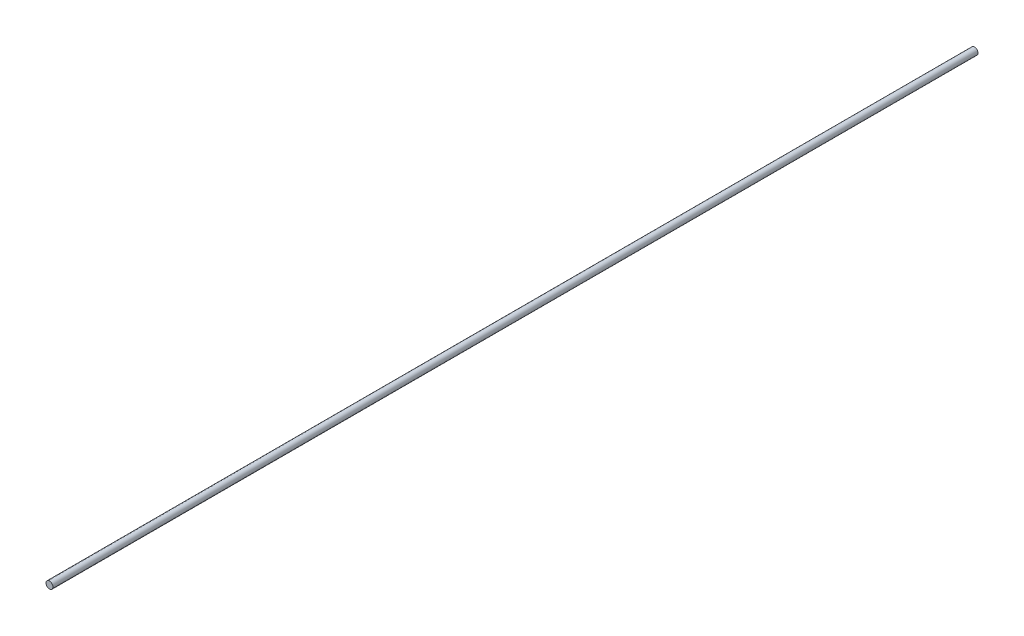
ISO-10303-21;
HEADER;
FILE_DESCRIPTION(('STEP AP214'),'2;1');
FILE_NAME('part.step','',(''),(''),'','','');
FILE_SCHEMA(('AUTOMOTIVE_DESIGN { 1 0 10303 214 1 1 1 1 }'));
ENDSEC;
DATA;
#1=APPLICATION_CONTEXT('core data for automotive mechanical design processes');
#2=APPLICATION_PROTOCOL_DEFINITION('international standard','automotive_design',2000,#1);
#3=PRODUCT_CONTEXT('',#1,'mechanical');
#4=PRODUCT('Part','Part','',(#3));
#5=PRODUCT_RELATED_PRODUCT_CATEGORY('part','',(#4));
#6=PRODUCT_DEFINITION_FORMATION('','',#4);
#7=PRODUCT_DEFINITION_CONTEXT('part definition',#1,'design');
#8=PRODUCT_DEFINITION('design','',#6,#7);
#9=PRODUCT_DEFINITION_SHAPE('','',#8);
#10=(LENGTH_UNIT() NAMED_UNIT(*) SI_UNIT(.MILLI.,.METRE.));
#11=(NAMED_UNIT(*) PLANE_ANGLE_UNIT() SI_UNIT($,.RADIAN.));
#12=(NAMED_UNIT(*) SI_UNIT($,.STERADIAN.) SOLID_ANGLE_UNIT());
#13=UNCERTAINTY_MEASURE_WITH_UNIT(LENGTH_MEASURE(1.E-05),#10,'distance_accuracy_value','');
#14=(GEOMETRIC_REPRESENTATION_CONTEXT(3) GLOBAL_UNCERTAINTY_ASSIGNED_CONTEXT((#13)) GLOBAL_UNIT_ASSIGNED_CONTEXT((#10,
#11,#12)) REPRESENTATION_CONTEXT('',''));
#15=CARTESIAN_POINT('',(0.,0.,0.));
#16=DIRECTION('',(0.,0.,1.));
#17=DIRECTION('',(1.,0.,0.));
#18=AXIS2_PLACEMENT_3D('',#15,#16,#17);
#19=CARTESIAN_POINT('',(0.,0.,400.));
#20=DIRECTION('',(0.,0.,-1.));
#21=DIRECTION('',(-1.,0.,0.));
#22=AXIS2_PLACEMENT_3D('',#19,#20,#21);
#23=CYLINDRICAL_SURFACE('',#22,1.5);
#24=CARTESIAN_POINT('',(0.,0.,400.));
#25=DIRECTION('',(0.,0.,1.));
#26=DIRECTION('',(1.,0.,0.));
#27=AXIS2_PLACEMENT_3D('',#24,#25,#26);
#28=CIRCLE('',#27,1.5);
#29=CARTESIAN_POINT('',(1.5,0.,400.));
#30=VERTEX_POINT('',#29);
#31=EDGE_CURVE('E10',#30,#30,#28,.T.);
#32=ORIENTED_EDGE('',*,*,#31,.F.);
#33=EDGE_LOOP('',(#32));
#34=FACE_BOUND('',#33,.T.);
#35=CARTESIAN_POINT('',(0.,0.,0.));
#36=DIRECTION('',(0.,0.,1.));
#37=DIRECTION('',(1.,0.,0.));
#38=AXIS2_PLACEMENT_3D('',#35,#36,#37);
#39=CIRCLE('',#38,1.5);
#40=CARTESIAN_POINT('',(1.5,0.,0.));
#41=VERTEX_POINT('',#40);
#42=EDGE_CURVE('E40',#41,#41,#39,.T.);
#43=ORIENTED_EDGE('',*,*,#42,.T.);
#44=EDGE_LOOP('',(#43));
#45=FACE_BOUND('',#44,.T.);
#46=ADVANCED_FACE('F37',(#34,#45),#23,.T.);
#47=CARTESIAN_POINT('',(0.,0.,400.));
#48=DIRECTION('',(0.,0.,1.));
#49=DIRECTION('',(1.,0.,0.));
#50=AXIS2_PLACEMENT_3D('',#47,#48,#49);
#51=PLANE('',#50);
#52=ORIENTED_EDGE('',*,*,#31,.T.);
#53=EDGE_LOOP('',(#52));
#54=FACE_BOUND('',#53,.T.);
#55=ADVANCED_FACE('F52',(#54),#51,.T.);
#56=CARTESIAN_POINT('',(0.,0.,0.));
#57=DIRECTION('',(0.,0.,1.));
#58=DIRECTION('',(1.,0.,0.));
#59=AXIS2_PLACEMENT_3D('',#56,#57,#58);
#60=PLANE('',#59);
#61=ORIENTED_EDGE('',*,*,#42,.F.);
#62=EDGE_LOOP('',(#61));
#63=FACE_BOUND('',#62,.T.);
#64=ADVANCED_FACE('F50',(#63),#60,.F.);
#65=CLOSED_SHELL('',(#46,#55,#64));
#66=MANIFOLD_SOLID_BREP('B2',#65);
#67=ADVANCED_BREP_SHAPE_REPRESENTATION('',(#18,#66),#14);
#68=SHAPE_DEFINITION_REPRESENTATION(#9,#67);
ENDSEC;
END-ISO-10303-21;
